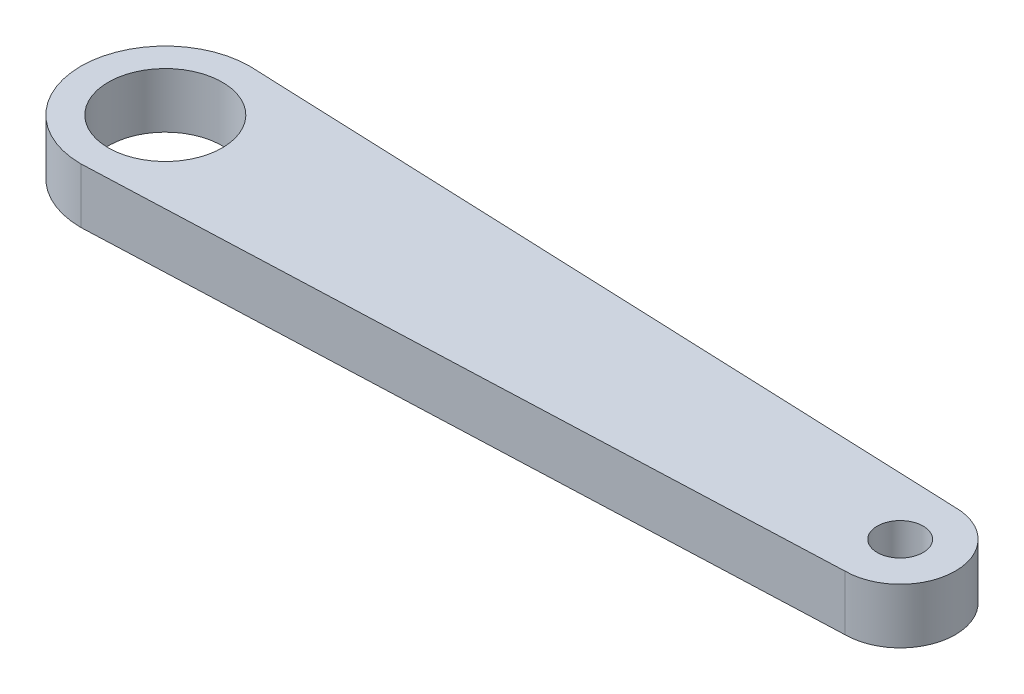
ISO-10303-21;
HEADER;
FILE_DESCRIPTION(('STEP AP214'),'2;1');
FILE_NAME('part.step','',(''),(''),'','','');
FILE_SCHEMA(('AUTOMOTIVE_DESIGN { 1 0 10303 214 1 1 1 1 }'));
ENDSEC;
DATA;
#1=APPLICATION_CONTEXT('core data for automotive mechanical design processes');
#2=APPLICATION_PROTOCOL_DEFINITION('international standard','automotive_design',2000,#1);
#3=PRODUCT_CONTEXT('',#1,'mechanical');
#4=PRODUCT('Part','Part','',(#3));
#5=PRODUCT_RELATED_PRODUCT_CATEGORY('part','',(#4));
#6=PRODUCT_DEFINITION_FORMATION('','',#4);
#7=PRODUCT_DEFINITION_CONTEXT('part definition',#1,'design');
#8=PRODUCT_DEFINITION('design','',#6,#7);
#9=PRODUCT_DEFINITION_SHAPE('','',#8);
#10=(LENGTH_UNIT() NAMED_UNIT(*) SI_UNIT(.MILLI.,.METRE.));
#11=(NAMED_UNIT(*) PLANE_ANGLE_UNIT() SI_UNIT($,.RADIAN.));
#12=(NAMED_UNIT(*) SI_UNIT($,.STERADIAN.) SOLID_ANGLE_UNIT());
#13=UNCERTAINTY_MEASURE_WITH_UNIT(LENGTH_MEASURE(1.E-05),#10,'distance_accuracy_value','');
#14=(GEOMETRIC_REPRESENTATION_CONTEXT(3) GLOBAL_UNCERTAINTY_ASSIGNED_CONTEXT((#13)) GLOBAL_UNIT_ASSIGNED_CONTEXT((#10,
#11,#12)) REPRESENTATION_CONTEXT('',''));
#15=CARTESIAN_POINT('',(0.,0.,0.));
#16=DIRECTION('',(0.,0.,1.));
#17=DIRECTION('',(1.,0.,0.));
#18=AXIS2_PLACEMENT_3D('',#15,#16,#17);
#19=CARTESIAN_POINT('',(0.18370607028754,3.,4.5926517571885));
#20=DIRECTION('',(0.0399680383488716,0.,0.999200958721789));
#21=DIRECTION('',(0.99920095872179,0.,-0.0399680383488716));
#22=AXIS2_PLACEMENT_3D('',#19,#20,#21);
#23=PLANE('',#22);
#24=DIRECTION('',(-0.99920095872179,0.,0.0399680383488716));
#25=VECTOR('',#24,1.);
#26=CARTESIAN_POINT('',(0.18370607028754,0.,4.5926517571885));
#27=LINE('',#26,#25);
#28=CARTESIAN_POINT('',(40.,0.,3.));
#29=VERTEX_POINT('',#28);
#30=CARTESIAN_POINT('',(0.,0.,4.6));
#31=VERTEX_POINT('',#30);
#32=EDGE_CURVE('E109',#29,#31,#27,.T.);
#33=ORIENTED_EDGE('',*,*,#32,.F.);
#34=DIRECTION('',(0.,-1.,0.));
#35=VECTOR('',#34,1.);
#36=CARTESIAN_POINT('',(40.,3.,3.));
#37=LINE('',#36,#35);
#38=CARTESIAN_POINT('',(40.,3.,3.));
#39=VERTEX_POINT('',#38);
#40=EDGE_CURVE('E11',#39,#29,#37,.T.);
#41=ORIENTED_EDGE('',*,*,#40,.F.);
#42=DIRECTION('',(-0.99920095872179,0.,0.0399680383488716));
#43=VECTOR('',#42,1.);
#44=CARTESIAN_POINT('',(0.18370607028754,3.,4.5926517571885));
#45=LINE('',#44,#43);
#46=CARTESIAN_POINT('',(0.,3.,4.6));
#47=VERTEX_POINT('',#46);
#48=EDGE_CURVE('E88',#39,#47,#45,.T.);
#49=ORIENTED_EDGE('',*,*,#48,.T.);
#50=DIRECTION('',(0.,-1.,0.));
#51=VECTOR('',#50,1.);
#52=CARTESIAN_POINT('',(0.,3.,4.6));
#53=LINE('',#52,#51);
#54=EDGE_CURVE('E77',#47,#31,#53,.T.);
#55=ORIENTED_EDGE('',*,*,#54,.T.);
#56=EDGE_LOOP('',(#33,#41,#49,#55));
#57=FACE_BOUND('',#56,.T.);
#58=ADVANCED_FACE('F39',(#57),#23,.T.);
#59=CARTESIAN_POINT('',(40.,3.,0.));
#60=DIRECTION('',(0.,-1.,0.));
#61=DIRECTION('',(0.,0.,-1.));
#62=AXIS2_PLACEMENT_3D('',#59,#60,#61);
#63=CYLINDRICAL_SURFACE('',#62,3.);
#64=CARTESIAN_POINT('',(40.,0.,0.));
#65=DIRECTION('',(0.,1.,0.));
#66=DIRECTION('',(0.,0.,1.));
#67=AXIS2_PLACEMENT_3D('',#64,#65,#66);
#68=CIRCLE('',#67,3.);
#69=CARTESIAN_POINT('',(40.,0.,-3.));
#70=VERTEX_POINT('',#69);
#71=EDGE_CURVE('E94',#29,#70,#68,.T.);
#72=ORIENTED_EDGE('',*,*,#71,.T.);
#73=DIRECTION('',(0.,-1.,0.));
#74=VECTOR('',#73,1.);
#75=CARTESIAN_POINT('',(40.,3.,-3.));
#76=LINE('',#75,#74);
#77=CARTESIAN_POINT('',(40.,3.,-3.));
#78=VERTEX_POINT('',#77);
#79=EDGE_CURVE('E47',#78,#70,#76,.T.);
#80=ORIENTED_EDGE('',*,*,#79,.F.);
#81=CARTESIAN_POINT('',(40.,3.,0.));
#82=DIRECTION('',(0.,1.,0.));
#83=DIRECTION('',(0.,0.,1.));
#84=AXIS2_PLACEMENT_3D('',#81,#82,#83);
#85=CIRCLE('',#84,3.);
#86=EDGE_CURVE('E82',#39,#78,#85,.T.);
#87=ORIENTED_EDGE('',*,*,#86,.F.);
#88=ORIENTED_EDGE('',*,*,#40,.T.);
#89=EDGE_LOOP('',(#72,#80,#87,#88));
#90=FACE_BOUND('',#89,.T.);
#91=ADVANCED_FACE('F92',(#90),#63,.T.);
#92=CARTESIAN_POINT('',(0.18370607028754,3.,-4.5926517571885));
#93=DIRECTION('',(0.0399680383488716,0.,-0.999200958721789));
#94=DIRECTION('',(-0.99920095872179,0.,-0.0399680383488716));
#95=AXIS2_PLACEMENT_3D('',#92,#93,#94);
#96=PLANE('',#95);
#97=DIRECTION('',(0.99920095872179,0.,0.0399680383488716));
#98=VECTOR('',#97,1.);
#99=CARTESIAN_POINT('',(0.18370607028754,0.,-4.5926517571885));
#100=LINE('',#99,#98);
#101=CARTESIAN_POINT('',(0.,0.,-4.6));
#102=VERTEX_POINT('',#101);
#103=EDGE_CURVE('E113',#102,#70,#100,.T.);
#104=ORIENTED_EDGE('',*,*,#103,.F.);
#105=DIRECTION('',(0.,-1.,0.));
#106=VECTOR('',#105,1.);
#107=CARTESIAN_POINT('',(0.,3.,-4.6));
#108=LINE('',#107,#106);
#109=CARTESIAN_POINT('',(0.,3.,-4.6));
#110=VERTEX_POINT('',#109);
#111=EDGE_CURVE('E70',#110,#102,#108,.T.);
#112=ORIENTED_EDGE('',*,*,#111,.F.);
#113=DIRECTION('',(0.99920095872179,0.,0.0399680383488716));
#114=VECTOR('',#113,1.);
#115=CARTESIAN_POINT('',(0.18370607028754,3.,-4.5926517571885));
#116=LINE('',#115,#114);
#117=EDGE_CURVE('E87',#110,#78,#116,.T.);
#118=ORIENTED_EDGE('',*,*,#117,.T.);
#119=ORIENTED_EDGE('',*,*,#79,.T.);
#120=EDGE_LOOP('',(#104,#112,#118,#119));
#121=FACE_BOUND('',#120,.T.);
#122=ADVANCED_FACE('F98',(#121),#96,.T.);
#123=CARTESIAN_POINT('',(0.,3.,0.));
#124=DIRECTION('',(0.,-1.,0.));
#125=DIRECTION('',(0.,0.,-1.));
#126=AXIS2_PLACEMENT_3D('',#123,#124,#125);
#127=CYLINDRICAL_SURFACE('',#126,3.1);
#128=CARTESIAN_POINT('',(0.,3.,0.));
#129=DIRECTION('',(0.,1.,0.));
#130=DIRECTION('',(0.,0.,1.));
#131=AXIS2_PLACEMENT_3D('',#128,#129,#130);
#132=CIRCLE('',#131,3.1);
#133=CARTESIAN_POINT('',(0.,3.,3.1));
#134=VERTEX_POINT('',#133);
#135=EDGE_CURVE('E100',#134,#134,#132,.T.);
#136=ORIENTED_EDGE('',*,*,#135,.T.);
#137=EDGE_LOOP('',(#136));
#138=FACE_BOUND('',#137,.T.);
#139=CARTESIAN_POINT('',(0.,0.,0.));
#140=DIRECTION('',(0.,1.,0.));
#141=DIRECTION('',(0.,0.,1.));
#142=AXIS2_PLACEMENT_3D('',#139,#140,#141);
#143=CIRCLE('',#142,3.1);
#144=CARTESIAN_POINT('',(0.,0.,3.1));
#145=VERTEX_POINT('',#144);
#146=EDGE_CURVE('E117',#145,#145,#143,.T.);
#147=ORIENTED_EDGE('',*,*,#146,.F.);
#148=EDGE_LOOP('',(#147));
#149=FACE_BOUND('',#148,.T.);
#150=ADVANCED_FACE('F133',(#138,#149),#127,.F.);
#151=CARTESIAN_POINT('',(0.,3.,0.));
#152=DIRECTION('',(0.,-1.,0.));
#153=DIRECTION('',(0.,0.,-1.));
#154=AXIS2_PLACEMENT_3D('',#151,#152,#153);
#155=CYLINDRICAL_SURFACE('',#154,4.6);
#156=CARTESIAN_POINT('',(0.,0.,0.));
#157=DIRECTION('',(0.,1.,0.));
#158=DIRECTION('',(0.,0.,1.));
#159=AXIS2_PLACEMENT_3D('',#156,#157,#158);
#160=CIRCLE('',#159,4.6);
#161=EDGE_CURVE('E115',#102,#31,#160,.T.);
#162=ORIENTED_EDGE('',*,*,#161,.T.);
#163=ORIENTED_EDGE('',*,*,#54,.F.);
#164=CARTESIAN_POINT('',(0.,3.,0.));
#165=DIRECTION('',(0.,1.,0.));
#166=DIRECTION('',(0.,0.,1.));
#167=AXIS2_PLACEMENT_3D('',#164,#165,#166);
#168=CIRCLE('',#167,4.6);
#169=EDGE_CURVE('E55',#110,#47,#168,.T.);
#170=ORIENTED_EDGE('',*,*,#169,.F.);
#171=ORIENTED_EDGE('',*,*,#111,.T.);
#172=EDGE_LOOP('',(#162,#163,#170,#171));
#173=FACE_BOUND('',#172,.T.);
#174=ADVANCED_FACE('F136',(#173),#155,.T.);
#175=CARTESIAN_POINT('',(40.,3.,0.));
#176=DIRECTION('',(0.,-1.,0.));
#177=DIRECTION('',(0.,0.,-1.));
#178=AXIS2_PLACEMENT_3D('',#175,#176,#177);
#179=CYLINDRICAL_SURFACE('',#178,1.25);
#180=CARTESIAN_POINT('',(40.,3.,0.));
#181=DIRECTION('',(0.,1.,0.));
#182=DIRECTION('',(0.,0.,1.));
#183=AXIS2_PLACEMENT_3D('',#180,#181,#182);
#184=CIRCLE('',#183,1.25);
#185=CARTESIAN_POINT('',(40.,3.,1.25));
#186=VERTEX_POINT('',#185);
#187=EDGE_CURVE('E106',#186,#186,#184,.T.);
#188=ORIENTED_EDGE('',*,*,#187,.T.);
#189=EDGE_LOOP('',(#188));
#190=FACE_BOUND('',#189,.T.);
#191=CARTESIAN_POINT('',(40.,0.,0.));
#192=DIRECTION('',(0.,1.,0.));
#193=DIRECTION('',(0.,0.,1.));
#194=AXIS2_PLACEMENT_3D('',#191,#192,#193);
#195=CIRCLE('',#194,1.25);
#196=CARTESIAN_POINT('',(40.,0.,1.25));
#197=VERTEX_POINT('',#196);
#198=EDGE_CURVE('E120',#197,#197,#195,.T.);
#199=ORIENTED_EDGE('',*,*,#198,.F.);
#200=EDGE_LOOP('',(#199));
#201=FACE_BOUND('',#200,.T.);
#202=ADVANCED_FACE('F139',(#190,#201),#179,.F.);
#203=CARTESIAN_POINT('',(0.,3.,0.));
#204=DIRECTION('',(0.,1.,0.));
#205=DIRECTION('',(0.,0.,1.));
#206=AXIS2_PLACEMENT_3D('',#203,#204,#205);
#207=PLANE('',#206);
#208=ORIENTED_EDGE('',*,*,#48,.F.);
#209=ORIENTED_EDGE('',*,*,#86,.T.);
#210=ORIENTED_EDGE('',*,*,#117,.F.);
#211=ORIENTED_EDGE('',*,*,#169,.T.);
#212=EDGE_LOOP('',(#208,#209,#210,#211));
#213=FACE_BOUND('',#212,.T.);
#214=ORIENTED_EDGE('',*,*,#135,.F.);
#215=EDGE_LOOP('',(#214));
#216=FACE_BOUND('',#215,.T.);
#217=ORIENTED_EDGE('',*,*,#187,.F.);
#218=EDGE_LOOP('',(#217));
#219=FACE_BOUND('',#218,.T.);
#220=ADVANCED_FACE('F84',(#213,#216,#219),#207,.T.);
#221=CARTESIAN_POINT('',(0.,0.,0.));
#222=DIRECTION('',(0.,1.,0.));
#223=DIRECTION('',(0.,0.,1.));
#224=AXIS2_PLACEMENT_3D('',#221,#222,#223);
#225=PLANE('',#224);
#226=ORIENTED_EDGE('',*,*,#32,.T.);
#227=ORIENTED_EDGE('',*,*,#161,.F.);
#228=ORIENTED_EDGE('',*,*,#103,.T.);
#229=ORIENTED_EDGE('',*,*,#71,.F.);
#230=EDGE_LOOP('',(#226,#227,#228,#229));
#231=FACE_BOUND('',#230,.T.);
#232=ORIENTED_EDGE('',*,*,#146,.T.);
#233=EDGE_LOOP('',(#232));
#234=FACE_BOUND('',#233,.T.);
#235=ORIENTED_EDGE('',*,*,#198,.T.);
#236=EDGE_LOOP('',(#235));
#237=FACE_BOUND('',#236,.T.);
#238=ADVANCED_FACE('F146',(#231,#234,#237),#225,.F.);
#239=CLOSED_SHELL('',(#58,#91,#122,#150,#174,#202,#220,#238));
#240=MANIFOLD_SOLID_BREP('B2',#239);
#241=ADVANCED_BREP_SHAPE_REPRESENTATION('',(#18,#240),#14);
#242=SHAPE_DEFINITION_REPRESENTATION(#9,#241);
ENDSEC;
END-ISO-10303-21;
